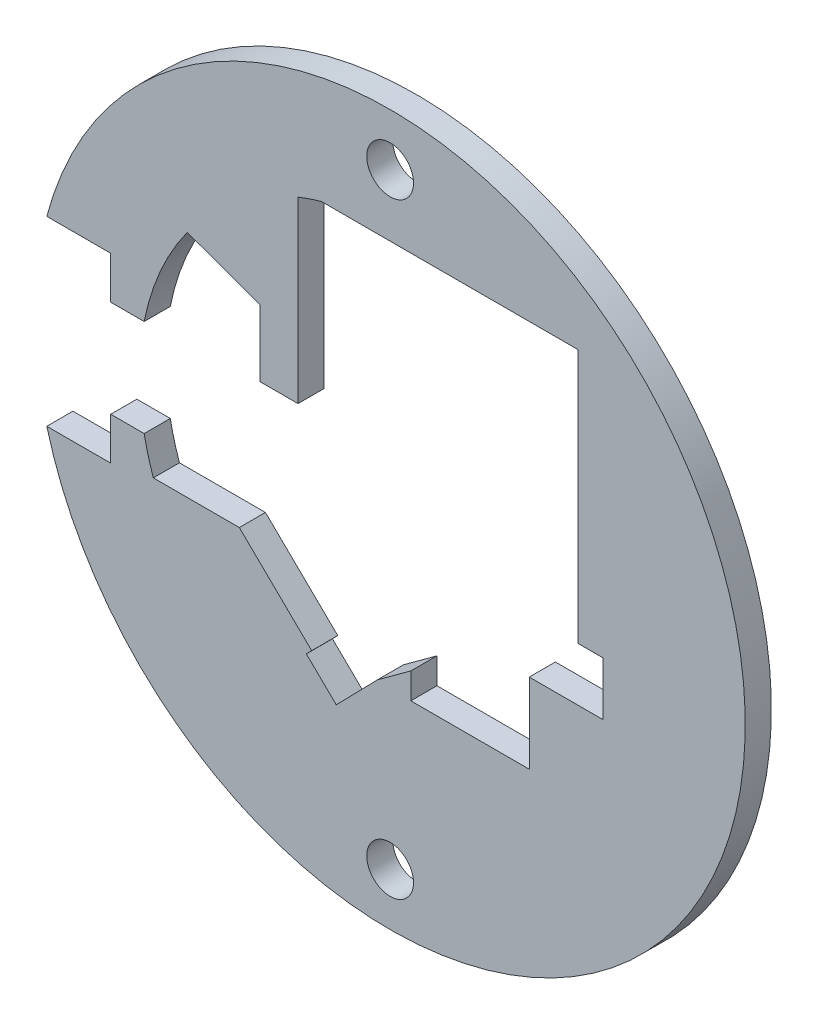
ISO-10303-21;
HEADER;
FILE_DESCRIPTION(('STEP AP214'),'2;1');
FILE_NAME('part.step','',(''),(''),'','','');
FILE_SCHEMA(('AUTOMOTIVE_DESIGN { 1 0 10303 214 1 1 1 1 }'));
ENDSEC;
DATA;
#1=APPLICATION_CONTEXT('core data for automotive mechanical design processes');
#2=APPLICATION_PROTOCOL_DEFINITION('international standard','automotive_design',2000,#1);
#3=PRODUCT_CONTEXT('',#1,'mechanical');
#4=PRODUCT('Part','Part','',(#3));
#5=PRODUCT_RELATED_PRODUCT_CATEGORY('part','',(#4));
#6=PRODUCT_DEFINITION_FORMATION('','',#4);
#7=PRODUCT_DEFINITION_CONTEXT('part definition',#1,'design');
#8=PRODUCT_DEFINITION('design','',#6,#7);
#9=PRODUCT_DEFINITION_SHAPE('','',#8);
#10=(LENGTH_UNIT() NAMED_UNIT(*) SI_UNIT(.MILLI.,.METRE.));
#11=(NAMED_UNIT(*) PLANE_ANGLE_UNIT() SI_UNIT($,.RADIAN.));
#12=(NAMED_UNIT(*) SI_UNIT($,.STERADIAN.) SOLID_ANGLE_UNIT());
#13=UNCERTAINTY_MEASURE_WITH_UNIT(LENGTH_MEASURE(1.E-05),#10,'distance_accuracy_value','');
#14=(GEOMETRIC_REPRESENTATION_CONTEXT(3) GLOBAL_UNCERTAINTY_ASSIGNED_CONTEXT((#13)) GLOBAL_UNIT_ASSIGNED_CONTEXT((#10,
#11,#12)) REPRESENTATION_CONTEXT('',''));
#15=CARTESIAN_POINT('',(0.,0.,0.));
#16=DIRECTION('',(0.,0.,1.));
#17=DIRECTION('',(1.,0.,0.));
#18=AXIS2_PLACEMENT_3D('',#15,#16,#17);
#19=CARTESIAN_POINT('',(0.,0.,1.5875));
#20=DIRECTION('',(0.,0.,-1.));
#21=DIRECTION('',(-1.,0.,0.));
#22=AXIS2_PLACEMENT_3D('',#19,#20,#21);
#23=CYLINDRICAL_SURFACE('',#22,15.24);
#24=CARTESIAN_POINT('',(0.,0.,0.));
#25=DIRECTION('',(0.,0.,1.));
#26=DIRECTION('',(1.,0.,0.));
#27=AXIS2_PLACEMENT_3D('',#24,#25,#26);
#28=CIRCLE('',#27,15.24);
#29=CARTESIAN_POINT('',(-4.17912985680031,14.6558,0.));
#30=VERTEX_POINT('',#29);
#31=CARTESIAN_POINT('',(-5.6007,14.1735584632089,0.));
#32=VERTEX_POINT('',#31);
#33=EDGE_CURVE('E256',#30,#32,#28,.T.);
#34=ORIENTED_EDGE('',*,*,#33,.F.);
#35=DIRECTION('',(0.,0.,-1.));
#36=VECTOR('',#35,1.);
#37=CARTESIAN_POINT('',(-4.17912985680031,14.6558,1.5875));
#38=LINE('',#37,#36);
#39=CARTESIAN_POINT('',(-4.17912985680031,14.6558,1.5875));
#40=VERTEX_POINT('',#39);
#41=EDGE_CURVE('E11',#40,#30,#38,.T.);
#42=ORIENTED_EDGE('',*,*,#41,.F.);
#43=CARTESIAN_POINT('',(0.,0.,1.5875));
#44=DIRECTION('',(0.,0.,1.));
#45=DIRECTION('',(1.,0.,0.));
#46=AXIS2_PLACEMENT_3D('',#43,#44,#45);
#47=CIRCLE('',#46,15.24);
#48=CARTESIAN_POINT('',(-5.6007,14.1735584632089,1.5875));
#49=VERTEX_POINT('',#48);
#50=EDGE_CURVE('E455',#40,#49,#47,.T.);
#51=ORIENTED_EDGE('',*,*,#50,.T.);
#52=DIRECTION('',(0.,0.,-1.));
#53=VECTOR('',#52,1.);
#54=CARTESIAN_POINT('',(-5.6007,14.1735584632089,1.5875));
#55=LINE('',#54,#53);
#56=EDGE_CURVE('E52',#49,#32,#55,.T.);
#57=ORIENTED_EDGE('',*,*,#56,.T.);
#58=EDGE_LOOP('',(#34,#42,#51,#57));
#59=FACE_BOUND('',#58,.T.);
#60=ADVANCED_FACE('F35',(#59),#23,.F.);
#61=CARTESIAN_POINT('',(0.,14.6558,1.5875));
#62=DIRECTION('',(0.,-1.,0.));
#63=DIRECTION('',(0.,0.,-1.));
#64=AXIS2_PLACEMENT_3D('',#61,#62,#63);
#65=PLANE('',#64);
#66=DIRECTION('',(-1.,0.,0.));
#67=VECTOR('',#66,1.);
#68=CARTESIAN_POINT('',(0.,14.6558,0.));
#69=LINE('',#68,#67);
#70=CARTESIAN_POINT('',(11.43,14.6558,0.));
#71=VERTEX_POINT('',#70);
#72=EDGE_CURVE('E258',#71,#30,#69,.T.);
#73=ORIENTED_EDGE('',*,*,#72,.F.);
#74=DIRECTION('',(0.,0.,-1.));
#75=VECTOR('',#74,1.);
#76=CARTESIAN_POINT('',(11.43,14.6558,1.5875));
#77=LINE('',#76,#75);
#78=CARTESIAN_POINT('',(11.43,14.6558,1.5875));
#79=VERTEX_POINT('',#78);
#80=EDGE_CURVE('E44',#79,#71,#77,.T.);
#81=ORIENTED_EDGE('',*,*,#80,.F.);
#82=DIRECTION('',(-1.,0.,0.));
#83=VECTOR('',#82,1.);
#84=CARTESIAN_POINT('',(0.,14.6558,1.5875));
#85=LINE('',#84,#83);
#86=EDGE_CURVE('E404',#79,#40,#85,.T.);
#87=ORIENTED_EDGE('',*,*,#86,.T.);
#88=ORIENTED_EDGE('',*,*,#41,.T.);
#89=EDGE_LOOP('',(#73,#81,#87,#88));
#90=FACE_BOUND('',#89,.T.);
#91=ADVANCED_FACE('F403',(#90),#65,.T.);
#92=CARTESIAN_POINT('',(11.43,0.,1.5875));
#93=DIRECTION('',(1.,0.,0.));
#94=DIRECTION('',(0.,1.,0.));
#95=AXIS2_PLACEMENT_3D('',#92,#93,#94);
#96=PLANE('',#95);
#97=DIRECTION('',(0.,-1.,0.));
#98=VECTOR('',#97,1.);
#99=CARTESIAN_POINT('',(11.43,0.,0.));
#100=LINE('',#99,#98);
#101=CARTESIAN_POINT('',(11.43,-0.812799999999999,0.));
#102=VERTEX_POINT('',#101);
#103=EDGE_CURVE('E262',#71,#102,#100,.T.);
#104=ORIENTED_EDGE('',*,*,#103,.T.);
#105=DIRECTION('',(0.,0.,-1.));
#106=VECTOR('',#105,1.);
#107=CARTESIAN_POINT('',(11.43,-0.812799999999999,1.5875));
#108=LINE('',#107,#106);
#109=CARTESIAN_POINT('',(11.43,-0.812799999999999,1.5875));
#110=VERTEX_POINT('',#109);
#111=EDGE_CURVE('E387',#110,#102,#108,.T.);
#112=ORIENTED_EDGE('',*,*,#111,.F.);
#113=DIRECTION('',(0.,-1.,0.));
#114=VECTOR('',#113,1.);
#115=CARTESIAN_POINT('',(11.43,0.,1.5875));
#116=LINE('',#115,#114);
#117=EDGE_CURVE('E395',#79,#110,#116,.T.);
#118=ORIENTED_EDGE('',*,*,#117,.F.);
#119=ORIENTED_EDGE('',*,*,#80,.T.);
#120=EDGE_LOOP('',(#104,#112,#118,#119));
#121=FACE_BOUND('',#120,.T.);
#122=ADVANCED_FACE('F392',(#121),#96,.F.);
#123=CARTESIAN_POINT('',(0.,-0.812799999999999,1.5875));
#124=DIRECTION('',(0.,1.,0.));
#125=DIRECTION('',(0.,0.,1.));
#126=AXIS2_PLACEMENT_3D('',#123,#124,#125);
#127=PLANE('',#126);
#128=DIRECTION('',(1.,0.,0.));
#129=VECTOR('',#128,1.);
#130=CARTESIAN_POINT('',(0.,-0.812799999999999,0.));
#131=LINE('',#130,#129);
#132=CARTESIAN_POINT('',(12.9413,-0.812799999999999,0.));
#133=VERTEX_POINT('',#132);
#134=EDGE_CURVE('E265',#102,#133,#131,.T.);
#135=ORIENTED_EDGE('',*,*,#134,.T.);
#136=DIRECTION('',(0.,0.,-1.));
#137=VECTOR('',#136,1.);
#138=CARTESIAN_POINT('',(12.9413,-0.812799999999999,1.5875));
#139=LINE('',#138,#137);
#140=CARTESIAN_POINT('',(12.9413,-0.812799999999999,1.5875));
#141=VERTEX_POINT('',#140);
#142=EDGE_CURVE('E384',#141,#133,#139,.T.);
#143=ORIENTED_EDGE('',*,*,#142,.F.);
#144=DIRECTION('',(1.,0.,0.));
#145=VECTOR('',#144,1.);
#146=CARTESIAN_POINT('',(0.,-0.812799999999999,1.5875));
#147=LINE('',#146,#145);
#148=EDGE_CURVE('E729',#110,#141,#147,.T.);
#149=ORIENTED_EDGE('',*,*,#148,.F.);
#150=ORIENTED_EDGE('',*,*,#111,.T.);
#151=EDGE_LOOP('',(#135,#143,#149,#150));
#152=FACE_BOUND('',#151,.T.);
#153=ADVANCED_FACE('F695',(#152),#127,.F.);
#154=CARTESIAN_POINT('',(12.9413,0.,1.5875));
#155=DIRECTION('',(1.,0.,0.));
#156=DIRECTION('',(0.,0.,-1.));
#157=AXIS2_PLACEMENT_3D('',#154,#155,#156);
#158=PLANE('',#157);
#159=DIRECTION('',(0.,-1.,0.));
#160=VECTOR('',#159,1.);
#161=CARTESIAN_POINT('',(12.9413,0.,0.));
#162=LINE('',#161,#160);
#163=CARTESIAN_POINT('',(12.9413,-4.064,0.));
#164=VERTEX_POINT('',#163);
#165=EDGE_CURVE('E268',#133,#164,#162,.T.);
#166=ORIENTED_EDGE('',*,*,#165,.T.);
#167=DIRECTION('',(0.,0.,-1.));
#168=VECTOR('',#167,1.);
#169=CARTESIAN_POINT('',(12.9413,-4.064,1.5875));
#170=LINE('',#169,#168);
#171=CARTESIAN_POINT('',(12.9413,-4.064,1.5875));
#172=VERTEX_POINT('',#171);
#173=EDGE_CURVE('E382',#172,#164,#170,.T.);
#174=ORIENTED_EDGE('',*,*,#173,.F.);
#175=DIRECTION('',(0.,-1.,0.));
#176=VECTOR('',#175,1.);
#177=CARTESIAN_POINT('',(12.9413,0.,1.5875));
#178=LINE('',#177,#176);
#179=EDGE_CURVE('E730',#141,#172,#178,.T.);
#180=ORIENTED_EDGE('',*,*,#179,.F.);
#181=ORIENTED_EDGE('',*,*,#142,.T.);
#182=EDGE_LOOP('',(#166,#174,#180,#181));
#183=FACE_BOUND('',#182,.T.);
#184=ADVANCED_FACE('F685',(#183),#158,.F.);
#185=CARTESIAN_POINT('',(0.,-4.064,1.5875));
#186=DIRECTION('',(0.,1.,0.));
#187=DIRECTION('',(0.,0.,1.));
#188=AXIS2_PLACEMENT_3D('',#185,#186,#187);
#189=PLANE('',#188);
#190=DIRECTION('',(1.,0.,0.));
#191=VECTOR('',#190,1.);
#192=CARTESIAN_POINT('',(0.,-4.064,0.));
#193=LINE('',#192,#191);
#194=CARTESIAN_POINT('',(8.4582,-4.064,0.));
#195=VERTEX_POINT('',#194);
#196=EDGE_CURVE('E271',#195,#164,#193,.T.);
#197=ORIENTED_EDGE('',*,*,#196,.F.);
#198=DIRECTION('',(0.,0.,-1.));
#199=VECTOR('',#198,1.);
#200=CARTESIAN_POINT('',(8.4582,-4.064,1.5875));
#201=LINE('',#200,#199);
#202=CARTESIAN_POINT('',(8.4582,-4.064,1.5875));
#203=VERTEX_POINT('',#202);
#204=EDGE_CURVE('E380',#203,#195,#201,.T.);
#205=ORIENTED_EDGE('',*,*,#204,.F.);
#206=DIRECTION('',(1.,0.,0.));
#207=VECTOR('',#206,1.);
#208=CARTESIAN_POINT('',(0.,-4.064,1.5875));
#209=LINE('',#208,#207);
#210=EDGE_CURVE('E735',#203,#172,#209,.T.);
#211=ORIENTED_EDGE('',*,*,#210,.T.);
#212=ORIENTED_EDGE('',*,*,#173,.T.);
#213=EDGE_LOOP('',(#197,#205,#211,#212));
#214=FACE_BOUND('',#213,.T.);
#215=ADVANCED_FACE('F674',(#214),#189,.T.);
#216=CARTESIAN_POINT('',(8.4582,0.,1.5875));
#217=DIRECTION('',(1.,0.,0.));
#218=DIRECTION('',(0.,0.,-1.));
#219=AXIS2_PLACEMENT_3D('',#216,#217,#218);
#220=PLANE('',#219);
#221=DIRECTION('',(0.,-1.,0.));
#222=VECTOR('',#221,1.);
#223=CARTESIAN_POINT('',(8.4582,0.,0.));
#224=LINE('',#223,#222);
#225=CARTESIAN_POINT('',(8.4582,-8.9154,0.));
#226=VERTEX_POINT('',#225);
#227=EDGE_CURVE('E274',#195,#226,#224,.T.);
#228=ORIENTED_EDGE('',*,*,#227,.T.);
#229=DIRECTION('',(0.,0.,-1.));
#230=VECTOR('',#229,1.);
#231=CARTESIAN_POINT('',(8.4582,-8.9154,1.5875));
#232=LINE('',#231,#230);
#233=CARTESIAN_POINT('',(8.4582,-8.9154,1.5875));
#234=VERTEX_POINT('',#233);
#235=EDGE_CURVE('E378',#234,#226,#232,.T.);
#236=ORIENTED_EDGE('',*,*,#235,.F.);
#237=DIRECTION('',(0.,-1.,0.));
#238=VECTOR('',#237,1.);
#239=CARTESIAN_POINT('',(8.4582,0.,1.5875));
#240=LINE('',#239,#238);
#241=EDGE_CURVE('E738',#203,#234,#240,.T.);
#242=ORIENTED_EDGE('',*,*,#241,.F.);
#243=ORIENTED_EDGE('',*,*,#204,.T.);
#244=EDGE_LOOP('',(#228,#236,#242,#243));
#245=FACE_BOUND('',#244,.T.);
#246=ADVANCED_FACE('F664',(#245),#220,.F.);
#247=CARTESIAN_POINT('',(0.,-8.9154,1.5875));
#248=DIRECTION('',(0.,1.,0.));
#249=DIRECTION('',(0.,0.,1.));
#250=AXIS2_PLACEMENT_3D('',#247,#248,#249);
#251=PLANE('',#250);
#252=DIRECTION('',(1.,0.,0.));
#253=VECTOR('',#252,1.);
#254=CARTESIAN_POINT('',(0.,-8.9154,0.));
#255=LINE('',#254,#253);
#256=CARTESIAN_POINT('',(1.2573,-8.9154,0.));
#257=VERTEX_POINT('',#256);
#258=EDGE_CURVE('E277',#257,#226,#255,.T.);
#259=ORIENTED_EDGE('',*,*,#258,.F.);
#260=DIRECTION('',(0.,0.,-1.));
#261=VECTOR('',#260,1.);
#262=CARTESIAN_POINT('',(1.2573,-8.9154,1.5875));
#263=LINE('',#262,#261);
#264=CARTESIAN_POINT('',(1.2573,-8.9154,1.5875));
#265=VERTEX_POINT('',#264);
#266=EDGE_CURVE('E376',#265,#257,#263,.T.);
#267=ORIENTED_EDGE('',*,*,#266,.F.);
#268=DIRECTION('',(1.,0.,0.));
#269=VECTOR('',#268,1.);
#270=CARTESIAN_POINT('',(0.,-8.9154,1.5875));
#271=LINE('',#270,#269);
#272=EDGE_CURVE('E740',#265,#234,#271,.T.);
#273=ORIENTED_EDGE('',*,*,#272,.T.);
#274=ORIENTED_EDGE('',*,*,#235,.T.);
#275=EDGE_LOOP('',(#259,#267,#273,#274));
#276=FACE_BOUND('',#275,.T.);
#277=ADVANCED_FACE('F654',(#276),#251,.T.);
#278=CARTESIAN_POINT('',(1.2573,0.,1.5875));
#279=DIRECTION('',(1.,0.,0.));
#280=DIRECTION('',(0.,1.,0.));
#281=AXIS2_PLACEMENT_3D('',#278,#279,#280);
#282=PLANE('',#281);
#283=DIRECTION('',(0.,-1.,0.));
#284=VECTOR('',#283,1.);
#285=CARTESIAN_POINT('',(1.2573,0.,0.));
#286=LINE('',#285,#284);
#287=CARTESIAN_POINT('',(1.2573,-7.3406,0.));
#288=VERTEX_POINT('',#287);
#289=EDGE_CURVE('E280',#288,#257,#286,.T.);
#290=ORIENTED_EDGE('',*,*,#289,.F.);
#291=DIRECTION('',(0.,0.,-1.));
#292=VECTOR('',#291,1.);
#293=CARTESIAN_POINT('',(1.2573,-7.3406,1.5875));
#294=LINE('',#293,#292);
#295=CARTESIAN_POINT('',(1.2573,-7.3406,1.5875));
#296=VERTEX_POINT('',#295);
#297=EDGE_CURVE('E374',#296,#288,#294,.T.);
#298=ORIENTED_EDGE('',*,*,#297,.F.);
#299=DIRECTION('',(0.,-1.,0.));
#300=VECTOR('',#299,1.);
#301=CARTESIAN_POINT('',(1.2573,0.,1.5875));
#302=LINE('',#301,#300);
#303=EDGE_CURVE('E743',#296,#265,#302,.T.);
#304=ORIENTED_EDGE('',*,*,#303,.T.);
#305=ORIENTED_EDGE('',*,*,#266,.T.);
#306=EDGE_LOOP('',(#290,#298,#304,#305));
#307=FACE_BOUND('',#306,.T.);
#308=ADVANCED_FACE('F644',(#307),#282,.T.);
#309=CARTESIAN_POINT('',(3.9356362264247,-5.38206663442695,1.5875));
#310=DIRECTION('',(-0.590269542075195,0.807206211384885,0.));
#311=DIRECTION('',(-0.807206211384885,-0.590269542075195,0.));
#312=AXIS2_PLACEMENT_3D('',#309,#310,#311);
#313=PLANE('',#312);
#314=DIRECTION('',(0.807206211384885,0.590269542075195,0.));
#315=VECTOR('',#314,1.);
#316=CARTESIAN_POINT('',(3.9356362264247,-5.38206663442695,0.));
#317=LINE('',#316,#315);
#318=CARTESIAN_POINT('',(-0.774699999999994,-8.82649999999999,0.));
#319=VERTEX_POINT('',#318);
#320=EDGE_CURVE('E283',#319,#288,#317,.T.);
#321=ORIENTED_EDGE('',*,*,#320,.F.);
#322=DIRECTION('',(0.,0.,-1.));
#323=VECTOR('',#322,1.);
#324=CARTESIAN_POINT('',(-0.774699999999994,-8.82649999999999,1.5875));
#325=LINE('',#324,#323);
#326=CARTESIAN_POINT('',(-0.774699999999994,-8.82649999999999,1.5875));
#327=VERTEX_POINT('',#326);
#328=EDGE_CURVE('E372',#327,#319,#325,.T.);
#329=ORIENTED_EDGE('',*,*,#328,.F.);
#330=DIRECTION('',(0.807206211384885,0.590269542075195,0.));
#331=VECTOR('',#330,1.);
#332=CARTESIAN_POINT('',(3.9356362264247,-5.38206663442695,1.5875));
#333=LINE('',#332,#331);
#334=EDGE_CURVE('E746',#327,#296,#333,.T.);
#335=ORIENTED_EDGE('',*,*,#334,.T.);
#336=ORIENTED_EDGE('',*,*,#297,.T.);
#337=EDGE_LOOP('',(#321,#329,#335,#336));
#338=FACE_BOUND('',#337,.T.);
#339=ADVANCED_FACE('F634',(#338),#313,.T.);
#340=CARTESIAN_POINT('',(4.01423347372456,-3.91037972961723,1.5875));
#341=DIRECTION('',(0.71631205673759,-0.697780078085039,0.));
#342=DIRECTION('',(0.697780078085039,0.71631205673759,0.));
#343=AXIS2_PLACEMENT_3D('',#340,#341,#342);
#344=PLANE('',#343);
#345=DIRECTION('',(-0.697780078085039,-0.71631205673759,0.));
#346=VECTOR('',#345,1.);
#347=CARTESIAN_POINT('',(4.01423347372456,-3.91037972961723,0.));
#348=LINE('',#347,#346);
#349=CARTESIAN_POINT('',(-3.27372957165375,-11.3919,0.));
#350=VERTEX_POINT('',#349);
#351=EDGE_CURVE('E286',#319,#350,#348,.T.);
#352=ORIENTED_EDGE('',*,*,#351,.T.);
#353=DIRECTION('',(0.,0.,-1.));
#354=VECTOR('',#353,1.);
#355=CARTESIAN_POINT('',(-3.27372957165375,-11.3919,1.5875));
#356=LINE('',#355,#354);
#357=CARTESIAN_POINT('',(-3.27372957165375,-11.3919,1.5875));
#358=VERTEX_POINT('',#357);
#359=EDGE_CURVE('E370',#358,#350,#356,.T.);
#360=ORIENTED_EDGE('',*,*,#359,.F.);
#361=DIRECTION('',(-0.697780078085039,-0.71631205673759,0.));
#362=VECTOR('',#361,1.);
#363=CARTESIAN_POINT('',(4.01423347372456,-3.91037972961723,1.5875));
#364=LINE('',#363,#362);
#365=EDGE_CURVE('E749',#327,#358,#364,.T.);
#366=ORIENTED_EDGE('',*,*,#365,.F.);
#367=ORIENTED_EDGE('',*,*,#328,.T.);
#368=EDGE_LOOP('',(#352,#360,#366,#367));
#369=FACE_BOUND('',#368,.T.);
#370=ADVANCED_FACE('F624',(#369),#344,.F.);
#371=CARTESIAN_POINT('',(-7.28796304537831,-7.48152027038277,1.5875));
#372=DIRECTION('',(0.697780078085039,0.71631205673759,0.));
#373=DIRECTION('',(-0.71631205673759,0.697780078085039,0.));
#374=AXIS2_PLACEMENT_3D('',#371,#372,#373);
#375=PLANE('',#374);
#376=DIRECTION('',(0.71631205673759,-0.697780078085039,0.));
#377=VECTOR('',#376,1.);
#378=CARTESIAN_POINT('',(-7.28796304537831,-7.48152027038277,0.));
#379=LINE('',#378,#377);
#380=CARTESIAN_POINT('',(-5.09316219576723,-9.619538601664,0.));
#381=VERTEX_POINT('',#380);
#382=EDGE_CURVE('E289',#381,#350,#379,.T.);
#383=ORIENTED_EDGE('',*,*,#382,.F.);
#384=DIRECTION('',(0.,0.,-1.));
#385=VECTOR('',#384,1.);
#386=CARTESIAN_POINT('',(-5.09316219576723,-9.619538601664,1.5875));
#387=LINE('',#386,#385);
#388=CARTESIAN_POINT('',(-5.09316219576723,-9.619538601664,1.5875));
#389=VERTEX_POINT('',#388);
#390=EDGE_CURVE('E368',#389,#381,#387,.T.);
#391=ORIENTED_EDGE('',*,*,#390,.F.);
#392=DIRECTION('',(0.71631205673759,-0.697780078085039,0.));
#393=VECTOR('',#392,1.);
#394=CARTESIAN_POINT('',(-7.28796304537831,-7.48152027038277,1.5875));
#395=LINE('',#394,#393);
#396=EDGE_CURVE('E751',#389,#358,#395,.T.);
#397=ORIENTED_EDGE('',*,*,#396,.T.);
#398=ORIENTED_EDGE('',*,*,#359,.T.);
#399=EDGE_LOOP('',(#383,#391,#397,#398));
#400=FACE_BOUND('',#399,.T.);
#401=ADVANCED_FACE('F614',(#400),#375,.T.);
#402=CARTESIAN_POINT('',(2.19480084961102,-2.13801833128113,1.5875));
#403=DIRECTION('',(0.716312056737598,-0.697780078085031,0.));
#404=DIRECTION('',(0.697780078085031,0.716312056737598,0.));
#405=AXIS2_PLACEMENT_3D('',#402,#403,#404);
#406=PLANE('',#405);
#407=DIRECTION('',(-0.697780078085031,-0.716312056737598,0.));
#408=VECTOR('',#407,1.);
#409=CARTESIAN_POINT('',(2.19480084961102,-2.13801833128113,0.));
#410=LINE('',#409,#408);
#411=CARTESIAN_POINT('',(-4.76970624057092,-9.28749214776329,0.));
#412=VERTEX_POINT('',#411);
#413=EDGE_CURVE('E292',#412,#381,#410,.T.);
#414=ORIENTED_EDGE('',*,*,#413,.F.);
#415=DIRECTION('',(0.,0.,-1.));
#416=VECTOR('',#415,1.);
#417=CARTESIAN_POINT('',(-4.76970624057092,-9.28749214776329,1.5875));
#418=LINE('',#417,#416);
#419=CARTESIAN_POINT('',(-4.76970624057092,-9.28749214776329,1.5875));
#420=VERTEX_POINT('',#419);
#421=EDGE_CURVE('E366',#420,#412,#418,.T.);
#422=ORIENTED_EDGE('',*,*,#421,.F.);
#423=DIRECTION('',(-0.697780078085031,-0.716312056737598,0.));
#424=VECTOR('',#423,1.);
#425=CARTESIAN_POINT('',(2.19480084961102,-2.13801833128113,1.5875));
#426=LINE('',#425,#424);
#427=EDGE_CURVE('E754',#420,#389,#426,.T.);
#428=ORIENTED_EDGE('',*,*,#427,.T.);
#429=ORIENTED_EDGE('',*,*,#390,.T.);
#430=EDGE_LOOP('',(#414,#422,#428,#429));
#431=FACE_BOUND('',#430,.T.);
#432=ADVANCED_FACE('F604',(#431),#406,.T.);
#433=CARTESIAN_POINT('',(-6.96450709018199,-7.14947381648206,1.5875));
#434=DIRECTION('',(0.697780078085039,0.71631205673759,0.));
#435=DIRECTION('',(-0.71631205673759,0.697780078085039,0.));
#436=AXIS2_PLACEMENT_3D('',#433,#434,#435);
#437=PLANE('',#436);
#438=DIRECTION('',(0.71631205673759,-0.697780078085039,0.));
#439=VECTOR('',#438,1.);
#440=CARTESIAN_POINT('',(-6.96450709018199,-7.14947381648206,0.));
#441=LINE('',#440,#439);
#442=CARTESIAN_POINT('',(-9.16716674304894,-5.0038,0.));
#443=VERTEX_POINT('',#442);
#444=EDGE_CURVE('E295',#443,#412,#441,.T.);
#445=ORIENTED_EDGE('',*,*,#444,.F.);
#446=DIRECTION('',(0.,0.,-1.));
#447=VECTOR('',#446,1.);
#448=CARTESIAN_POINT('',(-9.16716674304894,-5.0038,1.5875));
#449=LINE('',#448,#447);
#450=CARTESIAN_POINT('',(-9.16716674304894,-5.0038,1.5875));
#451=VERTEX_POINT('',#450);
#452=EDGE_CURVE('E364',#451,#443,#449,.T.);
#453=ORIENTED_EDGE('',*,*,#452,.F.);
#454=DIRECTION('',(0.71631205673759,-0.697780078085039,0.));
#455=VECTOR('',#454,1.);
#456=CARTESIAN_POINT('',(-6.96450709018199,-7.14947381648206,1.5875));
#457=LINE('',#456,#455);
#458=EDGE_CURVE('E456',#451,#420,#457,.T.);
#459=ORIENTED_EDGE('',*,*,#458,.T.);
#460=ORIENTED_EDGE('',*,*,#421,.T.);
#461=EDGE_LOOP('',(#445,#453,#459,#460));
#462=FACE_BOUND('',#461,.T.);
#463=ADVANCED_FACE('F434',(#462),#437,.T.);
#464=CARTESIAN_POINT('',(0.,-5.0038,1.5875));
#465=DIRECTION('',(0.,1.,0.));
#466=DIRECTION('',(0.,0.,1.));
#467=AXIS2_PLACEMENT_3D('',#464,#465,#466);
#468=PLANE('',#467);
#469=DIRECTION('',(1.,0.,0.));
#470=VECTOR('',#469,1.);
#471=CARTESIAN_POINT('',(0.,-5.0038,0.));
#472=LINE('',#471,#470);
#473=CARTESIAN_POINT('',(-14.3951236729665,-5.0038,0.));
#474=VERTEX_POINT('',#473);
#475=EDGE_CURVE('E298',#474,#443,#472,.T.);
#476=ORIENTED_EDGE('',*,*,#475,.F.);
#477=DIRECTION('',(0.,0.,-1.));
#478=VECTOR('',#477,1.);
#479=CARTESIAN_POINT('',(-14.3951236729665,-5.0038,1.5875));
#480=LINE('',#479,#478);
#481=CARTESIAN_POINT('',(-14.3951236729665,-5.0038,1.5875));
#482=VERTEX_POINT('',#481);
#483=EDGE_CURVE('E362',#482,#474,#480,.T.);
#484=ORIENTED_EDGE('',*,*,#483,.F.);
#485=DIRECTION('',(1.,0.,0.));
#486=VECTOR('',#485,1.);
#487=CARTESIAN_POINT('',(0.,-5.0038,1.5875));
#488=LINE('',#487,#486);
#489=EDGE_CURVE('E453',#482,#451,#488,.T.);
#490=ORIENTED_EDGE('',*,*,#489,.T.);
#491=ORIENTED_EDGE('',*,*,#452,.T.);
#492=EDGE_LOOP('',(#476,#484,#490,#491));
#493=FACE_BOUND('',#492,.T.);
#494=ADVANCED_FACE('F426',(#493),#468,.T.);
#495=CARTESIAN_POINT('',(-14.9520587441892,-2.9484808478801,0.));
#496=VERTEX_POINT('',#495);
#497=EDGE_CURVE('E259',#496,#474,#28,.T.);
#498=ORIENTED_EDGE('',*,*,#497,.F.);
#499=DIRECTION('',(0.,0.,-1.));
#500=VECTOR('',#499,1.);
#501=CARTESIAN_POINT('',(-14.9520587441892,-2.9484808478801,1.5875));
#502=LINE('',#501,#500);
#503=CARTESIAN_POINT('',(-14.9520587441892,-2.9484808478801,1.5875));
#504=VERTEX_POINT('',#503);
#505=EDGE_CURVE('E360',#504,#496,#502,.T.);
#506=ORIENTED_EDGE('',*,*,#505,.F.);
#507=EDGE_CURVE('E448',#504,#482,#47,.T.);
#508=ORIENTED_EDGE('',*,*,#507,.T.);
#509=ORIENTED_EDGE('',*,*,#483,.T.);
#510=EDGE_LOOP('',(#498,#506,#508,#509));
#511=FACE_BOUND('',#510,.T.);
#512=ADVANCED_FACE('F418',(#511),#23,.F.);
#513=CARTESIAN_POINT('',(0.,-2.94848084788009,1.5875));
#514=DIRECTION('',(0.,-1.,0.));
#515=DIRECTION('',(1.,0.,0.));
#516=AXIS2_PLACEMENT_3D('',#513,#514,#515);
#517=PLANE('',#516);
#518=DIRECTION('',(-1.,0.,0.));
#519=VECTOR('',#518,1.);
#520=CARTESIAN_POINT('',(0.,-2.94848084788009,0.));
#521=LINE('',#520,#519);
#522=CARTESIAN_POINT('',(-16.9840587441892,-2.9484808478801,0.));
#523=VERTEX_POINT('',#522);
#524=EDGE_CURVE('E301',#496,#523,#521,.T.);
#525=ORIENTED_EDGE('',*,*,#524,.T.);
#526=DIRECTION('',(0.,0.,-1.));
#527=VECTOR('',#526,1.);
#528=CARTESIAN_POINT('',(-16.9840587441892,-2.9484808478801,1.5875));
#529=LINE('',#528,#527);
#530=CARTESIAN_POINT('',(-16.9840587441892,-2.9484808478801,1.5875));
#531=VERTEX_POINT('',#530);
#532=EDGE_CURVE('E357',#531,#523,#529,.T.);
#533=ORIENTED_EDGE('',*,*,#532,.F.);
#534=DIRECTION('',(-1.,0.,0.));
#535=VECTOR('',#534,1.);
#536=CARTESIAN_POINT('',(0.,-2.94848084788009,1.5875));
#537=LINE('',#536,#535);
#538=EDGE_CURVE('E444',#504,#531,#537,.T.);
#539=ORIENTED_EDGE('',*,*,#538,.F.);
#540=ORIENTED_EDGE('',*,*,#505,.T.);
#541=EDGE_LOOP('',(#525,#533,#539,#540));
#542=FACE_BOUND('',#541,.T.);
#543=ADVANCED_FACE('F425',(#542),#517,.F.);
#544=CARTESIAN_POINT('',(-16.9840587441892,0.,1.5875));
#545=DIRECTION('',(1.,0.,0.));
#546=DIRECTION('',(0.,0.,-1.));
#547=AXIS2_PLACEMENT_3D('',#544,#545,#546);
#548=PLANE('',#547);
#549=DIRECTION('',(0.,-1.,0.));
#550=VECTOR('',#549,1.);
#551=CARTESIAN_POINT('',(-16.9840587441892,0.,0.));
#552=LINE('',#551,#550);
#553=CARTESIAN_POINT('',(-16.9840587441892,-5.5245,0.));
#554=VERTEX_POINT('',#553);
#555=EDGE_CURVE('E304',#523,#554,#552,.T.);
#556=ORIENTED_EDGE('',*,*,#555,.T.);
#557=DIRECTION('',(0.,0.,-1.));
#558=VECTOR('',#557,1.);
#559=CARTESIAN_POINT('',(-16.9840587441892,-5.5245,1.5875));
#560=LINE('',#559,#558);
#561=CARTESIAN_POINT('',(-16.9840587441892,-5.5245,1.5875));
#562=VERTEX_POINT('',#561);
#563=EDGE_CURVE('E354',#562,#554,#560,.T.);
#564=ORIENTED_EDGE('',*,*,#563,.F.);
#565=DIRECTION('',(0.,-1.,0.));
#566=VECTOR('',#565,1.);
#567=CARTESIAN_POINT('',(-16.9840587441892,0.,1.5875));
#568=LINE('',#567,#566);
#569=EDGE_CURVE('E447',#531,#562,#568,.T.);
#570=ORIENTED_EDGE('',*,*,#569,.F.);
#571=ORIENTED_EDGE('',*,*,#532,.T.);
#572=EDGE_LOOP('',(#556,#564,#570,#571));
#573=FACE_BOUND('',#572,.T.);
#574=ADVANCED_FACE('F432',(#573),#548,.F.);
#575=CARTESIAN_POINT('',(0.,-5.5245,1.5875));
#576=DIRECTION('',(0.,-1.,0.));
#577=DIRECTION('',(1.,0.,0.));
#578=AXIS2_PLACEMENT_3D('',#575,#576,#577);
#579=PLANE('',#578);
#580=DIRECTION('',(-1.,0.,0.));
#581=VECTOR('',#580,1.);
#582=CARTESIAN_POINT('',(0.,-5.5245,0.));
#583=LINE('',#582,#581);
#584=CARTESIAN_POINT('',(-20.8712242034338,-5.5245,0.));
#585=VERTEX_POINT('',#584);
#586=EDGE_CURVE('E307',#554,#585,#583,.T.);
#587=ORIENTED_EDGE('',*,*,#586,.T.);
#588=DIRECTION('',(0.,0.,-1.));
#589=VECTOR('',#588,1.);
#590=CARTESIAN_POINT('',(-20.8712242034338,-5.5245,1.5875));
#591=LINE('',#590,#589);
#592=CARTESIAN_POINT('',(-20.8712242034338,-5.5245,1.5875));
#593=VERTEX_POINT('',#592);
#594=EDGE_CURVE('E351',#593,#585,#591,.T.);
#595=ORIENTED_EDGE('',*,*,#594,.F.);
#596=DIRECTION('',(-1.,0.,0.));
#597=VECTOR('',#596,1.);
#598=CARTESIAN_POINT('',(0.,-5.5245,1.5875));
#599=LINE('',#598,#597);
#600=EDGE_CURVE('E760',#562,#593,#599,.T.);
#601=ORIENTED_EDGE('',*,*,#600,.F.);
#602=ORIENTED_EDGE('',*,*,#563,.T.);
#603=EDGE_LOOP('',(#587,#595,#601,#602));
#604=FACE_BOUND('',#603,.T.);
#605=ADVANCED_FACE('F560',(#604),#579,.F.);
#606=CARTESIAN_POINT('',(0.,0.,1.5875));
#607=DIRECTION('',(0.,0.,-1.));
#608=DIRECTION('',(-1.,0.,0.));
#609=AXIS2_PLACEMENT_3D('',#606,#607,#608);
#610=CYLINDRICAL_SURFACE('',#609,21.59);
#611=CARTESIAN_POINT('',(0.,0.,0.));
#612=DIRECTION('',(0.,0.,1.));
#613=DIRECTION('',(1.,0.,0.));
#614=AXIS2_PLACEMENT_3D('',#611,#612,#613);
#615=CIRCLE('',#614,21.59);
#616=CARTESIAN_POINT('',(-20.8712242034338,5.5245,0.));
#617=VERTEX_POINT('',#616);
#618=EDGE_CURVE('E310',#585,#617,#615,.T.);
#619=ORIENTED_EDGE('',*,*,#618,.T.);
#620=DIRECTION('',(0.,0.,-1.));
#621=VECTOR('',#620,1.);
#622=CARTESIAN_POINT('',(-20.8712242034338,5.5245,1.5875));
#623=LINE('',#622,#621);
#624=CARTESIAN_POINT('',(-20.8712242034338,5.5245,1.5875));
#625=VERTEX_POINT('',#624);
#626=EDGE_CURVE('E349',#625,#617,#623,.T.);
#627=ORIENTED_EDGE('',*,*,#626,.F.);
#628=CARTESIAN_POINT('',(0.,0.,1.5875));
#629=DIRECTION('',(0.,0.,1.));
#630=DIRECTION('',(1.,0.,0.));
#631=AXIS2_PLACEMENT_3D('',#628,#629,#630);
#632=CIRCLE('',#631,21.59);
#633=EDGE_CURVE('E763',#593,#625,#632,.T.);
#634=ORIENTED_EDGE('',*,*,#633,.F.);
#635=ORIENTED_EDGE('',*,*,#594,.T.);
#636=EDGE_LOOP('',(#619,#627,#634,#635));
#637=FACE_BOUND('',#636,.T.);
#638=ADVANCED_FACE('F550',(#637),#610,.T.);
#639=CARTESIAN_POINT('',(0.,5.5245,1.5875));
#640=DIRECTION('',(0.,-1.,0.));
#641=DIRECTION('',(0.,0.,-1.));
#642=AXIS2_PLACEMENT_3D('',#639,#640,#641);
#643=PLANE('',#642);
#644=DIRECTION('',(-1.,0.,0.));
#645=VECTOR('',#644,1.);
#646=CARTESIAN_POINT('',(0.,5.5245,0.));
#647=LINE('',#646,#645);
#648=CARTESIAN_POINT('',(-16.9840587441892,5.5245,0.));
#649=VERTEX_POINT('',#648);
#650=EDGE_CURVE('E313',#649,#617,#647,.T.);
#651=ORIENTED_EDGE('',*,*,#650,.F.);
#652=DIRECTION('',(0.,0.,-1.));
#653=VECTOR('',#652,1.);
#654=CARTESIAN_POINT('',(-16.9840587441892,5.5245,1.5875));
#655=LINE('',#654,#653);
#656=CARTESIAN_POINT('',(-16.9840587441892,5.5245,1.5875));
#657=VERTEX_POINT('',#656);
#658=EDGE_CURVE('E347',#657,#649,#655,.T.);
#659=ORIENTED_EDGE('',*,*,#658,.F.);
#660=DIRECTION('',(-1.,0.,0.));
#661=VECTOR('',#660,1.);
#662=CARTESIAN_POINT('',(0.,5.5245,1.5875));
#663=LINE('',#662,#661);
#664=EDGE_CURVE('E765',#657,#625,#663,.T.);
#665=ORIENTED_EDGE('',*,*,#664,.T.);
#666=ORIENTED_EDGE('',*,*,#626,.T.);
#667=EDGE_LOOP('',(#651,#659,#665,#666));
#668=FACE_BOUND('',#667,.T.);
#669=ADVANCED_FACE('F540',(#668),#643,.T.);
#670=CARTESIAN_POINT('',(-16.9840587441892,0.,1.5875));
#671=DIRECTION('',(-1.,0.,0.));
#672=DIRECTION('',(0.,0.,1.));
#673=AXIS2_PLACEMENT_3D('',#670,#671,#672);
#674=PLANE('',#673);
#675=DIRECTION('',(0.,1.,0.));
#676=VECTOR('',#675,1.);
#677=CARTESIAN_POINT('',(-16.9840587441892,0.,0.));
#678=LINE('',#677,#676);
#679=CARTESIAN_POINT('',(-16.9840587441892,2.9484808478801,0.));
#680=VERTEX_POINT('',#679);
#681=EDGE_CURVE('E316',#680,#649,#678,.T.);
#682=ORIENTED_EDGE('',*,*,#681,.F.);
#683=DIRECTION('',(0.,0.,-1.));
#684=VECTOR('',#683,1.);
#685=CARTESIAN_POINT('',(-16.9840587441892,2.9484808478801,1.5875));
#686=LINE('',#685,#684);
#687=CARTESIAN_POINT('',(-16.9840587441892,2.9484808478801,1.5875));
#688=VERTEX_POINT('',#687);
#689=EDGE_CURVE('E345',#688,#680,#686,.T.);
#690=ORIENTED_EDGE('',*,*,#689,.F.);
#691=DIRECTION('',(0.,1.,0.));
#692=VECTOR('',#691,1.);
#693=CARTESIAN_POINT('',(-16.9840587441892,0.,1.5875));
#694=LINE('',#693,#692);
#695=EDGE_CURVE('E768',#688,#657,#694,.T.);
#696=ORIENTED_EDGE('',*,*,#695,.T.);
#697=ORIENTED_EDGE('',*,*,#658,.T.);
#698=EDGE_LOOP('',(#682,#690,#696,#697));
#699=FACE_BOUND('',#698,.T.);
#700=ADVANCED_FACE('F530',(#699),#674,.T.);
#701=CARTESIAN_POINT('',(0.,2.9484808478801,1.5875));
#702=DIRECTION('',(0.,-1.,0.));
#703=DIRECTION('',(1.,0.,0.));
#704=AXIS2_PLACEMENT_3D('',#701,#702,#703);
#705=PLANE('',#704);
#706=DIRECTION('',(-1.,0.,0.));
#707=VECTOR('',#706,1.);
#708=CARTESIAN_POINT('',(0.,2.9484808478801,0.));
#709=LINE('',#708,#707);
#710=CARTESIAN_POINT('',(-14.9520587441892,2.9484808478801,0.));
#711=VERTEX_POINT('',#710);
#712=EDGE_CURVE('E319',#711,#680,#709,.T.);
#713=ORIENTED_EDGE('',*,*,#712,.F.);
#714=DIRECTION('',(0.,0.,-1.));
#715=VECTOR('',#714,1.);
#716=CARTESIAN_POINT('',(-14.9520587441892,2.9484808478801,1.5875));
#717=LINE('',#716,#715);
#718=CARTESIAN_POINT('',(-14.9520587441892,2.9484808478801,1.5875));
#719=VERTEX_POINT('',#718);
#720=EDGE_CURVE('E343',#719,#711,#717,.T.);
#721=ORIENTED_EDGE('',*,*,#720,.F.);
#722=DIRECTION('',(-1.,0.,0.));
#723=VECTOR('',#722,1.);
#724=CARTESIAN_POINT('',(0.,2.9484808478801,1.5875));
#725=LINE('',#724,#723);
#726=EDGE_CURVE('E771',#719,#688,#725,.T.);
#727=ORIENTED_EDGE('',*,*,#726,.T.);
#728=ORIENTED_EDGE('',*,*,#689,.T.);
#729=EDGE_LOOP('',(#713,#721,#727,#728));
#730=FACE_BOUND('',#729,.T.);
#731=ADVANCED_FACE('F520',(#730),#705,.T.);
#732=CARTESIAN_POINT('',(0.,0.,1.5875));
#733=DIRECTION('',(0.,0.,-1.));
#734=DIRECTION('',(-1.,0.,0.));
#735=AXIS2_PLACEMENT_3D('',#732,#733,#734);
#736=CYLINDRICAL_SURFACE('',#735,15.24);
#737=CARTESIAN_POINT('',(0.,0.,0.));
#738=DIRECTION('',(0.,0.,1.));
#739=DIRECTION('',(1.,0.,0.));
#740=AXIS2_PLACEMENT_3D('',#737,#738,#739);
#741=CIRCLE('',#740,15.24);
#742=CARTESIAN_POINT('',(-12.3325762819453,8.9535,0.));
#743=VERTEX_POINT('',#742);
#744=EDGE_CURVE('E322',#743,#711,#741,.T.);
#745=ORIENTED_EDGE('',*,*,#744,.F.);
#746=DIRECTION('',(0.,0.,-1.));
#747=VECTOR('',#746,1.);
#748=CARTESIAN_POINT('',(-12.3325762819453,8.9535,1.5875));
#749=LINE('',#748,#747);
#750=CARTESIAN_POINT('',(-12.3325762819453,8.9535,1.5875));
#751=VERTEX_POINT('',#750);
#752=EDGE_CURVE('E341',#751,#743,#749,.T.);
#753=ORIENTED_EDGE('',*,*,#752,.F.);
#754=CARTESIAN_POINT('',(0.,0.,1.5875));
#755=DIRECTION('',(0.,0.,1.));
#756=DIRECTION('',(1.,0.,0.));
#757=AXIS2_PLACEMENT_3D('',#754,#755,#756);
#758=CIRCLE('',#757,15.24);
#759=EDGE_CURVE('E774',#751,#719,#758,.T.);
#760=ORIENTED_EDGE('',*,*,#759,.T.);
#761=ORIENTED_EDGE('',*,*,#720,.T.);
#762=EDGE_LOOP('',(#745,#753,#760,#761));
#763=FACE_BOUND('',#762,.T.);
#764=ADVANCED_FACE('F510',(#763),#736,.F.);
#765=CARTESIAN_POINT('',(1.43838963998687,3.99376361532598,1.5875));
#766=DIRECTION('',(0.338851839147555,0.94083974783505,0.));
#767=DIRECTION('',(-0.94083974783505,0.338851839147555,0.));
#768=AXIS2_PLACEMENT_3D('',#765,#766,#767);
#769=PLANE('',#768);
#770=DIRECTION('',(0.94083974783505,-0.338851839147555,0.));
#771=VECTOR('',#770,1.);
#772=CARTESIAN_POINT('',(1.43838963998687,3.99376361532598,0.));
#773=LINE('',#772,#771);
#774=CARTESIAN_POINT('',(-7.9248,7.366,0.));
#775=VERTEX_POINT('',#774);
#776=EDGE_CURVE('E325',#743,#775,#773,.T.);
#777=ORIENTED_EDGE('',*,*,#776,.T.);
#778=DIRECTION('',(0.,0.,-1.));
#779=VECTOR('',#778,1.);
#780=CARTESIAN_POINT('',(-7.9248,7.366,1.5875));
#781=LINE('',#780,#779);
#782=CARTESIAN_POINT('',(-7.9248,7.366,1.5875));
#783=VERTEX_POINT('',#782);
#784=EDGE_CURVE('E231',#783,#775,#781,.T.);
#785=ORIENTED_EDGE('',*,*,#784,.F.);
#786=DIRECTION('',(0.94083974783505,-0.338851839147555,0.));
#787=VECTOR('',#786,1.);
#788=CARTESIAN_POINT('',(1.43838963998687,3.99376361532598,1.5875));
#789=LINE('',#788,#787);
#790=EDGE_CURVE('E241',#751,#783,#789,.T.);
#791=ORIENTED_EDGE('',*,*,#790,.F.);
#792=ORIENTED_EDGE('',*,*,#752,.T.);
#793=EDGE_LOOP('',(#777,#785,#791,#792));
#794=FACE_BOUND('',#793,.T.);
#795=ADVANCED_FACE('F501',(#794),#769,.F.);
#796=CARTESIAN_POINT('',(-7.9248,0.,1.5875));
#797=DIRECTION('',(-1.,0.,0.));
#798=DIRECTION('',(0.,0.,1.));
#799=AXIS2_PLACEMENT_3D('',#796,#797,#798);
#800=PLANE('',#799);
#801=DIRECTION('',(0.,1.,0.));
#802=VECTOR('',#801,1.);
#803=CARTESIAN_POINT('',(-7.9248,0.,0.));
#804=LINE('',#803,#802);
#805=CARTESIAN_POINT('',(-7.9248,3.302,0.));
#806=VERTEX_POINT('',#805);
#807=EDGE_CURVE('E227',#806,#775,#804,.T.);
#808=ORIENTED_EDGE('',*,*,#807,.F.);
#809=DIRECTION('',(0.,0.,-1.));
#810=VECTOR('',#809,1.);
#811=CARTESIAN_POINT('',(-7.9248,3.302,1.5875));
#812=LINE('',#811,#810);
#813=CARTESIAN_POINT('',(-7.9248,3.302,1.5875));
#814=VERTEX_POINT('',#813);
#815=EDGE_CURVE('E222',#814,#806,#812,.T.);
#816=ORIENTED_EDGE('',*,*,#815,.F.);
#817=DIRECTION('',(0.,1.,0.));
#818=VECTOR('',#817,1.);
#819=CARTESIAN_POINT('',(-7.9248,0.,1.5875));
#820=LINE('',#819,#818);
#821=EDGE_CURVE('E225',#814,#783,#820,.T.);
#822=ORIENTED_EDGE('',*,*,#821,.T.);
#823=ORIENTED_EDGE('',*,*,#784,.T.);
#824=EDGE_LOOP('',(#808,#816,#822,#823));
#825=FACE_BOUND('',#824,.T.);
#826=ADVANCED_FACE('F224',(#825),#800,.T.);
#827=CARTESIAN_POINT('',(0.,3.302,1.5875));
#828=DIRECTION('',(0.,-1.,0.));
#829=DIRECTION('',(1.,0.,0.));
#830=AXIS2_PLACEMENT_3D('',#827,#828,#829);
#831=PLANE('',#830);
#832=DIRECTION('',(-1.,0.,0.));
#833=VECTOR('',#832,1.);
#834=CARTESIAN_POINT('',(0.,3.302,0.));
#835=LINE('',#834,#833);
#836=CARTESIAN_POINT('',(-5.6007,3.302,0.));
#837=VERTEX_POINT('',#836);
#838=EDGE_CURVE('E329',#837,#806,#835,.T.);
#839=ORIENTED_EDGE('',*,*,#838,.F.);
#840=DIRECTION('',(0.,0.,-1.));
#841=VECTOR('',#840,1.);
#842=CARTESIAN_POINT('',(-5.6007,3.302,1.5875));
#843=LINE('',#842,#841);
#844=CARTESIAN_POINT('',(-5.6007,3.302,1.5875));
#845=VERTEX_POINT('',#844);
#846=EDGE_CURVE('E137',#845,#837,#843,.T.);
#847=ORIENTED_EDGE('',*,*,#846,.F.);
#848=DIRECTION('',(-1.,0.,0.));
#849=VECTOR('',#848,1.);
#850=CARTESIAN_POINT('',(0.,3.302,1.5875));
#851=LINE('',#850,#849);
#852=EDGE_CURVE('E238',#845,#814,#851,.T.);
#853=ORIENTED_EDGE('',*,*,#852,.T.);
#854=ORIENTED_EDGE('',*,*,#815,.T.);
#855=EDGE_LOOP('',(#839,#847,#853,#854));
#856=FACE_BOUND('',#855,.T.);
#857=ADVANCED_FACE('F244',(#856),#831,.T.);
#858=CARTESIAN_POINT('',(-5.6007,0.,1.5875));
#859=DIRECTION('',(1.,0.,0.));
#860=DIRECTION('',(0.,1.,0.));
#861=AXIS2_PLACEMENT_3D('',#858,#859,#860);
#862=PLANE('',#861);
#863=DIRECTION('',(0.,-1.,0.));
#864=VECTOR('',#863,1.);
#865=CARTESIAN_POINT('',(-5.6007,0.,0.));
#866=LINE('',#865,#864);
#867=EDGE_CURVE('E331',#32,#837,#866,.T.);
#868=ORIENTED_EDGE('',*,*,#867,.F.);
#869=ORIENTED_EDGE('',*,*,#56,.F.);
#870=DIRECTION('',(0.,-1.,0.));
#871=VECTOR('',#870,1.);
#872=CARTESIAN_POINT('',(-5.6007,0.,1.5875));
#873=LINE('',#872,#871);
#874=EDGE_CURVE('E245',#49,#845,#873,.T.);
#875=ORIENTED_EDGE('',*,*,#874,.T.);
#876=ORIENTED_EDGE('',*,*,#846,.T.);
#877=EDGE_LOOP('',(#868,#869,#875,#876));
#878=FACE_BOUND('',#877,.T.);
#879=ADVANCED_FACE('F405',(#878),#862,.T.);
#880=CARTESIAN_POINT('',(0.,18.415,1.5875));
#881=DIRECTION('',(0.,0.,-1.));
#882=DIRECTION('',(-1.,0.,0.));
#883=AXIS2_PLACEMENT_3D('',#880,#881,#882);
#884=CYLINDRICAL_SURFACE('',#883,1.4224);
#885=CARTESIAN_POINT('',(0.,18.415,1.5875));
#886=DIRECTION('',(0.,0.,1.));
#887=DIRECTION('',(1.,0.,0.));
#888=AXIS2_PLACEMENT_3D('',#885,#886,#887);
#889=CIRCLE('',#888,1.4224);
#890=CARTESIAN_POINT('',(1.42240000000001,18.415,1.5875));
#891=VERTEX_POINT('',#890);
#892=EDGE_CURVE('E337',#891,#891,#889,.T.);
#893=ORIENTED_EDGE('',*,*,#892,.T.);
#894=EDGE_LOOP('',(#893));
#895=FACE_BOUND('',#894,.T.);
#896=CARTESIAN_POINT('',(0.,18.415,0.));
#897=DIRECTION('',(0.,0.,1.));
#898=DIRECTION('',(1.,0.,0.));
#899=AXIS2_PLACEMENT_3D('',#896,#897,#898);
#900=CIRCLE('',#899,1.4224);
#901=CARTESIAN_POINT('',(1.42240000000001,18.415,0.));
#902=VERTEX_POINT('',#901);
#903=EDGE_CURVE('E253',#902,#902,#900,.T.);
#904=ORIENTED_EDGE('',*,*,#903,.F.);
#905=EDGE_LOOP('',(#904));
#906=FACE_BOUND('',#905,.T.);
#907=ADVANCED_FACE('F37',(#895,#906),#884,.F.);
#908=CARTESIAN_POINT('',(0.,-18.415,1.5875));
#909=DIRECTION('',(0.,0.,-1.));
#910=DIRECTION('',(-1.,0.,0.));
#911=AXIS2_PLACEMENT_3D('',#908,#909,#910);
#912=CYLINDRICAL_SURFACE('',#911,1.4224);
#913=CARTESIAN_POINT('',(0.,-18.415,1.5875));
#914=DIRECTION('',(0.,0.,1.));
#915=DIRECTION('',(1.,0.,0.));
#916=AXIS2_PLACEMENT_3D('',#913,#914,#915);
#917=CIRCLE('',#916,1.4224);
#918=CARTESIAN_POINT('',(1.42240000000001,-18.415,1.5875));
#919=VERTEX_POINT('',#918);
#920=EDGE_CURVE('E247',#919,#919,#917,.T.);
#921=ORIENTED_EDGE('',*,*,#920,.T.);
#922=EDGE_LOOP('',(#921));
#923=FACE_BOUND('',#922,.T.);
#924=CARTESIAN_POINT('',(0.,-18.415,0.));
#925=DIRECTION('',(0.,0.,1.));
#926=DIRECTION('',(1.,0.,0.));
#927=AXIS2_PLACEMENT_3D('',#924,#925,#926);
#928=CIRCLE('',#927,1.4224);
#929=CARTESIAN_POINT('',(1.42240000000001,-18.415,0.));
#930=VERTEX_POINT('',#929);
#931=EDGE_CURVE('E334',#930,#930,#928,.T.);
#932=ORIENTED_EDGE('',*,*,#931,.F.);
#933=EDGE_LOOP('',(#932));
#934=FACE_BOUND('',#933,.T.);
#935=ADVANCED_FACE('F412',(#923,#934),#912,.F.);
#936=CARTESIAN_POINT('',(0.,0.,1.5875));
#937=DIRECTION('',(0.,0.,1.));
#938=DIRECTION('',(1.,0.,0.));
#939=AXIS2_PLACEMENT_3D('',#936,#937,#938);
#940=PLANE('',#939);
#941=ORIENTED_EDGE('',*,*,#892,.F.);
#942=EDGE_LOOP('',(#941));
#943=FACE_BOUND('',#942,.T.);
#944=ORIENTED_EDGE('',*,*,#50,.F.);
#945=ORIENTED_EDGE('',*,*,#86,.F.);
#946=ORIENTED_EDGE('',*,*,#117,.T.);
#947=ORIENTED_EDGE('',*,*,#148,.T.);
#948=ORIENTED_EDGE('',*,*,#179,.T.);
#949=ORIENTED_EDGE('',*,*,#210,.F.);
#950=ORIENTED_EDGE('',*,*,#241,.T.);
#951=ORIENTED_EDGE('',*,*,#272,.F.);
#952=ORIENTED_EDGE('',*,*,#303,.F.);
#953=ORIENTED_EDGE('',*,*,#334,.F.);
#954=ORIENTED_EDGE('',*,*,#365,.T.);
#955=ORIENTED_EDGE('',*,*,#396,.F.);
#956=ORIENTED_EDGE('',*,*,#427,.F.);
#957=ORIENTED_EDGE('',*,*,#458,.F.);
#958=ORIENTED_EDGE('',*,*,#489,.F.);
#959=ORIENTED_EDGE('',*,*,#507,.F.);
#960=ORIENTED_EDGE('',*,*,#538,.T.);
#961=ORIENTED_EDGE('',*,*,#569,.T.);
#962=ORIENTED_EDGE('',*,*,#600,.T.);
#963=ORIENTED_EDGE('',*,*,#633,.T.);
#964=ORIENTED_EDGE('',*,*,#664,.F.);
#965=ORIENTED_EDGE('',*,*,#695,.F.);
#966=ORIENTED_EDGE('',*,*,#726,.F.);
#967=ORIENTED_EDGE('',*,*,#759,.F.);
#968=ORIENTED_EDGE('',*,*,#790,.T.);
#969=ORIENTED_EDGE('',*,*,#821,.F.);
#970=ORIENTED_EDGE('',*,*,#852,.F.);
#971=ORIENTED_EDGE('',*,*,#874,.F.);
#972=EDGE_LOOP('',(#944,#945,#946,#947,#948,#949,#950,#951,#952,#953,#954,#955,#956,#957,#958,
#959,#960,#961,#962,#963,#964,#965,#966,#967,#968,#969,#970,#971));
#973=FACE_BOUND('',#972,.T.);
#974=ORIENTED_EDGE('',*,*,#920,.F.);
#975=EDGE_LOOP('',(#974));
#976=FACE_BOUND('',#975,.T.);
#977=ADVANCED_FACE('F235',(#943,#973,#976),#940,.T.);
#978=CARTESIAN_POINT('',(0.,0.,0.));
#979=DIRECTION('',(0.,0.,1.));
#980=DIRECTION('',(1.,0.,0.));
#981=AXIS2_PLACEMENT_3D('',#978,#979,#980);
#982=PLANE('',#981);
#983=ORIENTED_EDGE('',*,*,#903,.T.);
#984=EDGE_LOOP('',(#983));
#985=FACE_BOUND('',#984,.T.);
#986=ORIENTED_EDGE('',*,*,#33,.T.);
#987=ORIENTED_EDGE('',*,*,#867,.T.);
#988=ORIENTED_EDGE('',*,*,#838,.T.);
#989=ORIENTED_EDGE('',*,*,#807,.T.);
#990=ORIENTED_EDGE('',*,*,#776,.F.);
#991=ORIENTED_EDGE('',*,*,#744,.T.);
#992=ORIENTED_EDGE('',*,*,#712,.T.);
#993=ORIENTED_EDGE('',*,*,#681,.T.);
#994=ORIENTED_EDGE('',*,*,#650,.T.);
#995=ORIENTED_EDGE('',*,*,#618,.F.);
#996=ORIENTED_EDGE('',*,*,#586,.F.);
#997=ORIENTED_EDGE('',*,*,#555,.F.);
#998=ORIENTED_EDGE('',*,*,#524,.F.);
#999=ORIENTED_EDGE('',*,*,#497,.T.);
#1000=ORIENTED_EDGE('',*,*,#475,.T.);
#1001=ORIENTED_EDGE('',*,*,#444,.T.);
#1002=ORIENTED_EDGE('',*,*,#413,.T.);
#1003=ORIENTED_EDGE('',*,*,#382,.T.);
#1004=ORIENTED_EDGE('',*,*,#351,.F.);
#1005=ORIENTED_EDGE('',*,*,#320,.T.);
#1006=ORIENTED_EDGE('',*,*,#289,.T.);
#1007=ORIENTED_EDGE('',*,*,#258,.T.);
#1008=ORIENTED_EDGE('',*,*,#227,.F.);
#1009=ORIENTED_EDGE('',*,*,#196,.T.);
#1010=ORIENTED_EDGE('',*,*,#165,.F.);
#1011=ORIENTED_EDGE('',*,*,#134,.F.);
#1012=ORIENTED_EDGE('',*,*,#103,.F.);
#1013=ORIENTED_EDGE('',*,*,#72,.T.);
#1014=EDGE_LOOP('',(#986,#987,#988,#989,#990,#991,#992,#993,#994,#995,#996,#997,#998,#999,#1000,
#1001,#1002,#1003,#1004,#1005,#1006,#1007,#1008,#1009,#1010,#1011,#1012,#1013));
#1015=FACE_BOUND('',#1014,.T.);
#1016=ORIENTED_EDGE('',*,*,#931,.T.);
#1017=EDGE_LOOP('',(#1016));
#1018=FACE_BOUND('',#1017,.T.);
#1019=ADVANCED_FACE('F401',(#985,#1015,#1018),#982,.F.);
#1020=CLOSED_SHELL('',(#60,#91,#122,#153,#184,#215,#246,#277,#308,#339,#370,#401,#432,#463,#494,
#512,#543,#574,#605,#638,#669,#700,#731,#764,#795,#826,#857,#879,#907,#935,#977,#1019));
#1021=MANIFOLD_SOLID_BREP('B2',#1020);
#1022=ADVANCED_BREP_SHAPE_REPRESENTATION('',(#18,#1021),#14);
#1023=SHAPE_DEFINITION_REPRESENTATION(#9,#1022);
ENDSEC;
END-ISO-10303-21;
